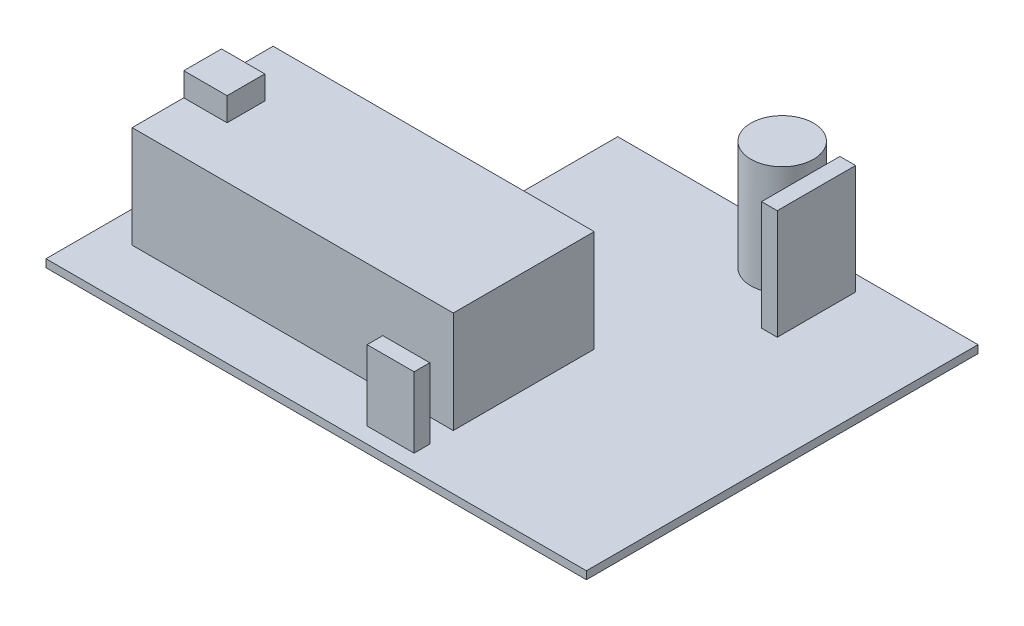
ISO-10303-21;
HEADER;
FILE_DESCRIPTION(('STEP AP214'),'2;1');
FILE_NAME('part.step','',(''),(''),'','','');
FILE_SCHEMA(('AUTOMOTIVE_DESIGN { 1 0 10303 214 1 1 1 1 }'));
ENDSEC;
DATA;
#1=APPLICATION_CONTEXT('core data for automotive mechanical design processes');
#2=APPLICATION_PROTOCOL_DEFINITION('international standard','automotive_design',2000,#1);
#3=PRODUCT_CONTEXT('',#1,'mechanical');
#4=PRODUCT('Part','Part','',(#3));
#5=PRODUCT_RELATED_PRODUCT_CATEGORY('part','',(#4));
#6=PRODUCT_DEFINITION_FORMATION('','',#4);
#7=PRODUCT_DEFINITION_CONTEXT('part definition',#1,'design');
#8=PRODUCT_DEFINITION('design','',#6,#7);
#9=PRODUCT_DEFINITION_SHAPE('','',#8);
#10=(LENGTH_UNIT() NAMED_UNIT(*) SI_UNIT(.MILLI.,.METRE.));
#11=(NAMED_UNIT(*) PLANE_ANGLE_UNIT() SI_UNIT($,.RADIAN.));
#12=(NAMED_UNIT(*) SI_UNIT($,.STERADIAN.) SOLID_ANGLE_UNIT());
#13=UNCERTAINTY_MEASURE_WITH_UNIT(LENGTH_MEASURE(1.E-05),#10,'distance_accuracy_value','');
#14=(GEOMETRIC_REPRESENTATION_CONTEXT(3) GLOBAL_UNCERTAINTY_ASSIGNED_CONTEXT((#13)) GLOBAL_UNIT_ASSIGNED_CONTEXT((#10,
#11,#12)) REPRESENTATION_CONTEXT('',''));
#15=CARTESIAN_POINT('',(0.,0.,0.));
#16=DIRECTION('',(0.,0.,1.));
#17=DIRECTION('',(1.,0.,0.));
#18=AXIS2_PLACEMENT_3D('',#15,#16,#17);
#19=CARTESIAN_POINT('',(0.,1.,0.));
#20=DIRECTION('',(0.,1.,0.));
#21=DIRECTION('',(0.,0.,1.));
#22=AXIS2_PLACEMENT_3D('',#19,#20,#21);
#23=PLANE('',#22);
#24=DIRECTION('',(1.,0.,0.));
#25=VECTOR('',#24,1.);
#26=CARTESIAN_POINT('',(0.,1.,-50.));
#27=LINE('',#26,#25);
#28=CARTESIAN_POINT('',(48.,1.,-50.));
#29=VERTEX_POINT('',#28);
#30=CARTESIAN_POINT('',(69.,1.,-50.));
#31=VERTEX_POINT('',#30);
#32=EDGE_CURVE('E312',#29,#31,#27,.T.);
#33=ORIENTED_EDGE('',*,*,#32,.F.);
#34=CARTESIAN_POINT('',(48.,1.,-46.));
#35=DIRECTION('',(0.,1.,0.));
#36=DIRECTION('',(0.,0.,1.));
#37=AXIS2_PLACEMENT_3D('',#34,#35,#36);
#38=CIRCLE('',#37,4.00000000000001);
#39=EDGE_CURVE('E57',#29,#29,#38,.T.);
#40=ORIENTED_EDGE('',*,*,#39,.F.);
#41=CARTESIAN_POINT('',(23.,1.,-50.));
#42=VERTEX_POINT('',#41);
#43=EDGE_CURVE('E308',#42,#29,#27,.T.);
#44=ORIENTED_EDGE('',*,*,#43,.F.);
#45=DIRECTION('',(0.,0.,1.));
#46=VECTOR('',#45,1.);
#47=CARTESIAN_POINT('',(23.,1.,0.));
#48=LINE('',#47,#46);
#49=CARTESIAN_POINT('',(23.,1.,-32.));
#50=VERTEX_POINT('',#49);
#51=EDGE_CURVE('E311',#42,#50,#48,.T.);
#52=ORIENTED_EDGE('',*,*,#51,.T.);
#53=DIRECTION('',(1.,0.,0.));
#54=VECTOR('',#53,1.);
#55=CARTESIAN_POINT('',(0.,1.,-32.));
#56=LINE('',#55,#54);
#57=CARTESIAN_POINT('',(0.,1.,-32.));
#58=VERTEX_POINT('',#57);
#59=EDGE_CURVE('E314',#58,#50,#56,.T.);
#60=ORIENTED_EDGE('',*,*,#59,.F.);
#61=DIRECTION('',(0.,0.,-1.));
#62=VECTOR('',#61,1.);
#63=CARTESIAN_POINT('',(0.,1.,0.));
#64=LINE('',#63,#62);
#65=CARTESIAN_POINT('',(0.,1.,0.));
#66=VERTEX_POINT('',#65);
#67=EDGE_CURVE('E317',#66,#58,#64,.T.);
#68=ORIENTED_EDGE('',*,*,#67,.F.);
#69=DIRECTION('',(1.,0.,0.));
#70=VECTOR('',#69,1.);
#71=CARTESIAN_POINT('',(0.,1.,0.));
#72=LINE('',#71,#70);
#73=CARTESIAN_POINT('',(69.,1.,0.));
#74=VERTEX_POINT('',#73);
#75=EDGE_CURVE('E320',#66,#74,#72,.T.);
#76=ORIENTED_EDGE('',*,*,#75,.T.);
#77=DIRECTION('',(0.,0.,-1.));
#78=VECTOR('',#77,1.);
#79=CARTESIAN_POINT('',(69.,1.,0.));
#80=LINE('',#79,#78);
#81=EDGE_CURVE('E322',#74,#31,#80,.T.);
#82=ORIENTED_EDGE('',*,*,#81,.T.);
#83=EDGE_LOOP('',(#33,#40,#44,#52,#60,#68,#76,#82));
#84=FACE_BOUND('',#83,.T.);
#85=DIRECTION('',(1.,0.,0.));
#86=VECTOR('',#85,1.);
#87=CARTESIAN_POINT('',(4.,1.,-7.));
#88=LINE('',#87,#86);
#89=CARTESIAN_POINT('',(4.,1.,-7.));
#90=VERTEX_POINT('',#89);
#91=CARTESIAN_POINT('',(45.,1.,-7.));
#92=VERTEX_POINT('',#91);
#93=EDGE_CURVE('E291',#90,#92,#88,.T.);
#94=ORIENTED_EDGE('',*,*,#93,.F.);
#95=DIRECTION('',(0.,0.,1.));
#96=VECTOR('',#95,1.);
#97=CARTESIAN_POINT('',(4.,1.,-25.));
#98=LINE('',#97,#96);
#99=CARTESIAN_POINT('',(4.,1.,-25.));
#100=VERTEX_POINT('',#99);
#101=EDGE_CURVE('E278',#100,#90,#98,.T.);
#102=ORIENTED_EDGE('',*,*,#101,.F.);
#103=DIRECTION('',(-1.,0.,0.));
#104=VECTOR('',#103,1.);
#105=CARTESIAN_POINT('',(4.,1.,-25.));
#106=LINE('',#105,#104);
#107=CARTESIAN_POINT('',(45.,1.,-25.));
#108=VERTEX_POINT('',#107);
#109=EDGE_CURVE('E296',#108,#100,#106,.T.);
#110=ORIENTED_EDGE('',*,*,#109,.F.);
#111=DIRECTION('',(0.,0.,-1.));
#112=VECTOR('',#111,1.);
#113=CARTESIAN_POINT('',(45.,1.,-25.));
#114=LINE('',#113,#112);
#115=EDGE_CURVE('E293',#92,#108,#114,.T.);
#116=ORIENTED_EDGE('',*,*,#115,.F.);
#117=EDGE_LOOP('',(#94,#102,#110,#116));
#118=FACE_BOUND('',#117,.T.);
#119=DIRECTION('',(-1.,0.,0.));
#120=VECTOR('',#119,1.);
#121=CARTESIAN_POINT('',(45.,1.,-4.));
#122=LINE('',#121,#120);
#123=CARTESIAN_POINT('',(45.,1.,-4.));
#124=VERTEX_POINT('',#123);
#125=CARTESIAN_POINT('',(39.,1.,-4.));
#126=VERTEX_POINT('',#125);
#127=EDGE_CURVE('E233',#124,#126,#122,.T.);
#128=ORIENTED_EDGE('',*,*,#127,.F.);
#129=DIRECTION('',(0.,0.,-1.));
#130=VECTOR('',#129,1.);
#131=CARTESIAN_POINT('',(45.,1.,-4.));
#132=LINE('',#131,#130);
#133=CARTESIAN_POINT('',(45.,1.,-2.));
#134=VERTEX_POINT('',#133);
#135=EDGE_CURVE('E218',#134,#124,#132,.T.);
#136=ORIENTED_EDGE('',*,*,#135,.F.);
#137=DIRECTION('',(1.,0.,0.));
#138=VECTOR('',#137,1.);
#139=CARTESIAN_POINT('',(45.,1.,-2.));
#140=LINE('',#139,#138);
#141=CARTESIAN_POINT('',(39.,1.,-2.));
#142=VERTEX_POINT('',#141);
#143=EDGE_CURVE('E224',#142,#134,#140,.T.);
#144=ORIENTED_EDGE('',*,*,#143,.F.);
#145=DIRECTION('',(0.,0.,1.));
#146=VECTOR('',#145,1.);
#147=CARTESIAN_POINT('',(39.,1.,-4.));
#148=LINE('',#147,#146);
#149=EDGE_CURVE('E235',#126,#142,#148,.T.);
#150=ORIENTED_EDGE('',*,*,#149,.F.);
#151=EDGE_LOOP('',(#128,#136,#144,#150));
#152=FACE_BOUND('',#151,.T.);
#153=DIRECTION('',(1.,0.,0.));
#154=VECTOR('',#153,1.);
#155=CARTESIAN_POINT('',(53.3685470889416,1.,-38.));
#156=LINE('',#155,#154);
#157=CARTESIAN_POINT('',(53.3685470889416,1.,-38.));
#158=VERTEX_POINT('',#157);
#159=CARTESIAN_POINT('',(55.3685470889416,1.,-38.));
#160=VERTEX_POINT('',#159);
#161=EDGE_CURVE('E649',#158,#160,#156,.T.);
#162=ORIENTED_EDGE('',*,*,#161,.F.);
#163=DIRECTION('',(0.,0.,1.));
#164=VECTOR('',#163,1.);
#165=CARTESIAN_POINT('',(53.3685470889416,1.,-48.));
#166=LINE('',#165,#164);
#167=CARTESIAN_POINT('',(53.3685470889416,1.,-48.));
#168=VERTEX_POINT('',#167);
#169=EDGE_CURVE('E209',#168,#158,#166,.T.);
#170=ORIENTED_EDGE('',*,*,#169,.F.);
#171=DIRECTION('',(-1.,0.,0.));
#172=VECTOR('',#171,1.);
#173=CARTESIAN_POINT('',(53.3685470889416,1.,-48.));
#174=LINE('',#173,#172);
#175=CARTESIAN_POINT('',(55.3685470889416,1.,-48.));
#176=VERTEX_POINT('',#175);
#177=EDGE_CURVE('E205',#176,#168,#174,.T.);
#178=ORIENTED_EDGE('',*,*,#177,.F.);
#179=DIRECTION('',(0.,0.,-1.));
#180=VECTOR('',#179,1.);
#181=CARTESIAN_POINT('',(55.3685470889416,1.,-48.));
#182=LINE('',#181,#180);
#183=EDGE_CURVE('E646',#160,#176,#182,.T.);
#184=ORIENTED_EDGE('',*,*,#183,.F.);
#185=EDGE_LOOP('',(#162,#170,#178,#184));
#186=FACE_BOUND('',#185,.T.);
#187=ADVANCED_FACE('F36',(#84,#118,#152,#186),#23,.T.);
#188=CARTESIAN_POINT('',(0.,1.,-50.));
#189=DIRECTION('',(0.,0.,-1.));
#190=DIRECTION('',(-1.,0.,0.));
#191=AXIS2_PLACEMENT_3D('',#188,#189,#190);
#192=PLANE('',#191);
#193=DIRECTION('',(1.,0.,0.));
#194=VECTOR('',#193,1.);
#195=CARTESIAN_POINT('',(0.,0.,-50.));
#196=LINE('',#195,#194);
#197=CARTESIAN_POINT('',(23.,0.,-50.));
#198=VERTEX_POINT('',#197);
#199=CARTESIAN_POINT('',(69.,0.,-50.));
#200=VERTEX_POINT('',#199);
#201=EDGE_CURVE('E307',#198,#200,#196,.T.);
#202=ORIENTED_EDGE('',*,*,#201,.F.);
#203=DIRECTION('',(0.,-1.,0.));
#204=VECTOR('',#203,1.);
#205=CARTESIAN_POINT('',(23.,1.,-50.));
#206=LINE('',#205,#204);
#207=EDGE_CURVE('E11',#42,#198,#206,.T.);
#208=ORIENTED_EDGE('',*,*,#207,.F.);
#209=ORIENTED_EDGE('',*,*,#43,.T.);
#210=ORIENTED_EDGE('',*,*,#32,.T.);
#211=DIRECTION('',(0.,-1.,0.));
#212=VECTOR('',#211,1.);
#213=CARTESIAN_POINT('',(69.,1.,-50.));
#214=LINE('',#213,#212);
#215=EDGE_CURVE('E325',#31,#200,#214,.T.);
#216=ORIENTED_EDGE('',*,*,#215,.T.);
#217=EDGE_LOOP('',(#202,#208,#209,#210,#216));
#218=FACE_BOUND('',#217,.T.);
#219=ADVANCED_FACE('F38',(#218),#192,.T.);
#220=CARTESIAN_POINT('',(23.,1.,0.));
#221=DIRECTION('',(1.,0.,0.));
#222=DIRECTION('',(0.,0.,-1.));
#223=AXIS2_PLACEMENT_3D('',#220,#221,#222);
#224=PLANE('',#223);
#225=DIRECTION('',(0.,0.,1.));
#226=VECTOR('',#225,1.);
#227=CARTESIAN_POINT('',(23.,0.,0.));
#228=LINE('',#227,#226);
#229=CARTESIAN_POINT('',(23.,0.,-32.));
#230=VERTEX_POINT('',#229);
#231=EDGE_CURVE('E328',#198,#230,#228,.T.);
#232=ORIENTED_EDGE('',*,*,#231,.T.);
#233=DIRECTION('',(0.,-1.,0.));
#234=VECTOR('',#233,1.);
#235=CARTESIAN_POINT('',(23.,1.,-32.));
#236=LINE('',#235,#234);
#237=EDGE_CURVE('E44',#50,#230,#236,.T.);
#238=ORIENTED_EDGE('',*,*,#237,.F.);
#239=ORIENTED_EDGE('',*,*,#51,.F.);
#240=ORIENTED_EDGE('',*,*,#207,.T.);
#241=EDGE_LOOP('',(#232,#238,#239,#240));
#242=FACE_BOUND('',#241,.T.);
#243=ADVANCED_FACE('F357',(#242),#224,.F.);
#244=CARTESIAN_POINT('',(0.,1.,-32.));
#245=DIRECTION('',(0.,0.,-1.));
#246=DIRECTION('',(-1.,0.,0.));
#247=AXIS2_PLACEMENT_3D('',#244,#245,#246);
#248=PLANE('',#247);
#249=DIRECTION('',(1.,0.,0.));
#250=VECTOR('',#249,1.);
#251=CARTESIAN_POINT('',(0.,0.,-32.));
#252=LINE('',#251,#250);
#253=CARTESIAN_POINT('',(0.,0.,-32.));
#254=VERTEX_POINT('',#253);
#255=EDGE_CURVE('E331',#254,#230,#252,.T.);
#256=ORIENTED_EDGE('',*,*,#255,.F.);
#257=DIRECTION('',(0.,-1.,0.));
#258=VECTOR('',#257,1.);
#259=CARTESIAN_POINT('',(0.,1.,-32.));
#260=LINE('',#259,#258);
#261=EDGE_CURVE('E348',#58,#254,#260,.T.);
#262=ORIENTED_EDGE('',*,*,#261,.F.);
#263=ORIENTED_EDGE('',*,*,#59,.T.);
#264=ORIENTED_EDGE('',*,*,#237,.T.);
#265=EDGE_LOOP('',(#256,#262,#263,#264));
#266=FACE_BOUND('',#265,.T.);
#267=ADVANCED_FACE('F352',(#266),#248,.T.);
#268=CARTESIAN_POINT('',(0.,1.,0.));
#269=DIRECTION('',(-1.,0.,0.));
#270=DIRECTION('',(0.,0.,1.));
#271=AXIS2_PLACEMENT_3D('',#268,#269,#270);
#272=PLANE('',#271);
#273=DIRECTION('',(0.,0.,-1.));
#274=VECTOR('',#273,1.);
#275=CARTESIAN_POINT('',(0.,0.,0.));
#276=LINE('',#275,#274);
#277=CARTESIAN_POINT('',(0.,0.,0.));
#278=VERTEX_POINT('',#277);
#279=EDGE_CURVE('E334',#278,#254,#276,.T.);
#280=ORIENTED_EDGE('',*,*,#279,.F.);
#281=DIRECTION('',(0.,-1.,0.));
#282=VECTOR('',#281,1.);
#283=CARTESIAN_POINT('',(0.,1.,0.));
#284=LINE('',#283,#282);
#285=EDGE_CURVE('E346',#66,#278,#284,.T.);
#286=ORIENTED_EDGE('',*,*,#285,.F.);
#287=ORIENTED_EDGE('',*,*,#67,.T.);
#288=ORIENTED_EDGE('',*,*,#261,.T.);
#289=EDGE_LOOP('',(#280,#286,#287,#288));
#290=FACE_BOUND('',#289,.T.);
#291=ADVANCED_FACE('F365',(#290),#272,.T.);
#292=CARTESIAN_POINT('',(0.,1.,0.));
#293=DIRECTION('',(0.,0.,-1.));
#294=DIRECTION('',(-1.,0.,0.));
#295=AXIS2_PLACEMENT_3D('',#292,#293,#294);
#296=PLANE('',#295);
#297=DIRECTION('',(1.,0.,0.));
#298=VECTOR('',#297,1.);
#299=CARTESIAN_POINT('',(0.,0.,0.));
#300=LINE('',#299,#298);
#301=CARTESIAN_POINT('',(69.,0.,0.));
#302=VERTEX_POINT('',#301);
#303=EDGE_CURVE('E337',#278,#302,#300,.T.);
#304=ORIENTED_EDGE('',*,*,#303,.T.);
#305=DIRECTION('',(0.,-1.,0.));
#306=VECTOR('',#305,1.);
#307=CARTESIAN_POINT('',(69.,1.,0.));
#308=LINE('',#307,#306);
#309=EDGE_CURVE('E343',#74,#302,#308,.T.);
#310=ORIENTED_EDGE('',*,*,#309,.F.);
#311=ORIENTED_EDGE('',*,*,#75,.F.);
#312=ORIENTED_EDGE('',*,*,#285,.T.);
#313=EDGE_LOOP('',(#304,#310,#311,#312));
#314=FACE_BOUND('',#313,.T.);
#315=ADVANCED_FACE('F379',(#314),#296,.F.);
#316=CARTESIAN_POINT('',(69.,1.,0.));
#317=DIRECTION('',(-1.,0.,0.));
#318=DIRECTION('',(0.,0.,1.));
#319=AXIS2_PLACEMENT_3D('',#316,#317,#318);
#320=PLANE('',#319);
#321=DIRECTION('',(0.,0.,-1.));
#322=VECTOR('',#321,1.);
#323=CARTESIAN_POINT('',(69.,0.,0.));
#324=LINE('',#323,#322);
#325=EDGE_CURVE('E339',#302,#200,#324,.T.);
#326=ORIENTED_EDGE('',*,*,#325,.T.);
#327=ORIENTED_EDGE('',*,*,#215,.F.);
#328=ORIENTED_EDGE('',*,*,#81,.F.);
#329=ORIENTED_EDGE('',*,*,#309,.T.);
#330=EDGE_LOOP('',(#326,#327,#328,#329));
#331=FACE_BOUND('',#330,.T.);
#332=ADVANCED_FACE('F375',(#331),#320,.F.);
#333=CARTESIAN_POINT('',(0.,0.,0.));
#334=DIRECTION('',(0.,1.,0.));
#335=DIRECTION('',(0.,0.,1.));
#336=AXIS2_PLACEMENT_3D('',#333,#334,#335);
#337=PLANE('',#336);
#338=ORIENTED_EDGE('',*,*,#201,.T.);
#339=ORIENTED_EDGE('',*,*,#325,.F.);
#340=ORIENTED_EDGE('',*,*,#303,.F.);
#341=ORIENTED_EDGE('',*,*,#279,.T.);
#342=ORIENTED_EDGE('',*,*,#255,.T.);
#343=ORIENTED_EDGE('',*,*,#231,.F.);
#344=EDGE_LOOP('',(#338,#339,#340,#341,#342,#343));
#345=FACE_BOUND('',#344,.T.);
#346=ADVANCED_FACE('F360',(#345),#337,.F.);
#347=CARTESIAN_POINT('',(4.,14.,-25.));
#348=DIRECTION('',(1.,0.,0.));
#349=DIRECTION('',(0.,0.,-1.));
#350=AXIS2_PLACEMENT_3D('',#347,#348,#349);
#351=PLANE('',#350);
#352=ORIENTED_EDGE('',*,*,#101,.T.);
#353=DIRECTION('',(0.,-1.,0.));
#354=VECTOR('',#353,1.);
#355=CARTESIAN_POINT('',(4.,14.,-7.));
#356=LINE('',#355,#354);
#357=CARTESIAN_POINT('',(4.,14.,-7.));
#358=VERTEX_POINT('',#357);
#359=EDGE_CURVE('E305',#358,#90,#356,.T.);
#360=ORIENTED_EDGE('',*,*,#359,.F.);
#361=DIRECTION('',(0.,0.,1.));
#362=VECTOR('',#361,1.);
#363=CARTESIAN_POINT('',(4.,14.,-25.));
#364=LINE('',#363,#362);
#365=CARTESIAN_POINT('',(4.,14.,-13.5914102064778));
#366=VERTEX_POINT('',#365);
#367=EDGE_CURVE('E282',#366,#358,#364,.T.);
#368=ORIENTED_EDGE('',*,*,#367,.F.);
#369=DIRECTION('',(0.,-1.,0.));
#370=VECTOR('',#369,1.);
#371=CARTESIAN_POINT('',(4.,17.,-13.5914102064778));
#372=LINE('',#371,#370);
#373=CARTESIAN_POINT('',(4.,17.,-13.5914102064778));
#374=VERTEX_POINT('',#373);
#375=EDGE_CURVE('E275',#374,#366,#372,.T.);
#376=ORIENTED_EDGE('',*,*,#375,.F.);
#377=DIRECTION('',(0.,0.,1.));
#378=VECTOR('',#377,1.);
#379=CARTESIAN_POINT('',(4.,17.,-18.4085897935222));
#380=LINE('',#379,#378);
#381=CARTESIAN_POINT('',(4.,17.,-18.4085897935222));
#382=VERTEX_POINT('',#381);
#383=EDGE_CURVE('E249',#382,#374,#380,.T.);
#384=ORIENTED_EDGE('',*,*,#383,.F.);
#385=DIRECTION('',(0.,-1.,0.));
#386=VECTOR('',#385,1.);
#387=CARTESIAN_POINT('',(4.,17.,-18.4085897935222));
#388=LINE('',#387,#386);
#389=CARTESIAN_POINT('',(4.,14.,-18.4085897935222));
#390=VERTEX_POINT('',#389);
#391=EDGE_CURVE('E259',#382,#390,#388,.T.);
#392=ORIENTED_EDGE('',*,*,#391,.T.);
#393=CARTESIAN_POINT('',(4.,14.,-25.));
#394=VERTEX_POINT('',#393);
#395=EDGE_CURVE('E279',#394,#390,#364,.T.);
#396=ORIENTED_EDGE('',*,*,#395,.F.);
#397=DIRECTION('',(0.,-1.,0.));
#398=VECTOR('',#397,1.);
#399=CARTESIAN_POINT('',(4.,14.,-25.));
#400=LINE('',#399,#398);
#401=EDGE_CURVE('E288',#394,#100,#400,.T.);
#402=ORIENTED_EDGE('',*,*,#401,.T.);
#403=EDGE_LOOP('',(#352,#360,#368,#376,#384,#392,#396,#402));
#404=FACE_BOUND('',#403,.T.);
#405=ADVANCED_FACE('F395',(#404),#351,.F.);
#406=CARTESIAN_POINT('',(4.,14.,-7.));
#407=DIRECTION('',(0.,0.,-1.));
#408=DIRECTION('',(-1.,0.,0.));
#409=AXIS2_PLACEMENT_3D('',#406,#407,#408);
#410=PLANE('',#409);
#411=ORIENTED_EDGE('',*,*,#93,.T.);
#412=DIRECTION('',(0.,-1.,0.));
#413=VECTOR('',#412,1.);
#414=CARTESIAN_POINT('',(45.,14.,-7.));
#415=LINE('',#414,#413);
#416=CARTESIAN_POINT('',(45.,14.,-7.));
#417=VERTEX_POINT('',#416);
#418=EDGE_CURVE('E302',#417,#92,#415,.T.);
#419=ORIENTED_EDGE('',*,*,#418,.F.);
#420=DIRECTION('',(1.,0.,0.));
#421=VECTOR('',#420,1.);
#422=CARTESIAN_POINT('',(4.,14.,-7.));
#423=LINE('',#422,#421);
#424=EDGE_CURVE('E281',#358,#417,#423,.T.);
#425=ORIENTED_EDGE('',*,*,#424,.F.);
#426=ORIENTED_EDGE('',*,*,#359,.T.);
#427=EDGE_LOOP('',(#411,#419,#425,#426));
#428=FACE_BOUND('',#427,.T.);
#429=ADVANCED_FACE('F401',(#428),#410,.F.);
#430=CARTESIAN_POINT('',(45.,14.,-25.));
#431=DIRECTION('',(-1.,0.,0.));
#432=DIRECTION('',(0.,0.,1.));
#433=AXIS2_PLACEMENT_3D('',#430,#431,#432);
#434=PLANE('',#433);
#435=ORIENTED_EDGE('',*,*,#115,.T.);
#436=DIRECTION('',(0.,-1.,0.));
#437=VECTOR('',#436,1.);
#438=CARTESIAN_POINT('',(45.,14.,-25.));
#439=LINE('',#438,#437);
#440=CARTESIAN_POINT('',(45.,14.,-25.));
#441=VERTEX_POINT('',#440);
#442=EDGE_CURVE('E300',#441,#108,#439,.T.);
#443=ORIENTED_EDGE('',*,*,#442,.F.);
#444=DIRECTION('',(0.,0.,-1.));
#445=VECTOR('',#444,1.);
#446=CARTESIAN_POINT('',(45.,14.,-25.));
#447=LINE('',#446,#445);
#448=EDGE_CURVE('E284',#417,#441,#447,.T.);
#449=ORIENTED_EDGE('',*,*,#448,.F.);
#450=ORIENTED_EDGE('',*,*,#418,.T.);
#451=EDGE_LOOP('',(#435,#443,#449,#450));
#452=FACE_BOUND('',#451,.T.);
#453=ADVANCED_FACE('F406',(#452),#434,.F.);
#454=CARTESIAN_POINT('',(4.,14.,-25.));
#455=DIRECTION('',(0.,0.,1.));
#456=DIRECTION('',(1.,0.,0.));
#457=AXIS2_PLACEMENT_3D('',#454,#455,#456);
#458=PLANE('',#457);
#459=ORIENTED_EDGE('',*,*,#109,.T.);
#460=ORIENTED_EDGE('',*,*,#401,.F.);
#461=DIRECTION('',(-1.,0.,0.));
#462=VECTOR('',#461,1.);
#463=CARTESIAN_POINT('',(4.,14.,-25.));
#464=LINE('',#463,#462);
#465=EDGE_CURVE('E286',#441,#394,#464,.T.);
#466=ORIENTED_EDGE('',*,*,#465,.F.);
#467=ORIENTED_EDGE('',*,*,#442,.T.);
#468=EDGE_LOOP('',(#459,#460,#466,#467));
#469=FACE_BOUND('',#468,.T.);
#470=ADVANCED_FACE('F452',(#469),#458,.F.);
#471=CARTESIAN_POINT('',(0.,14.,0.));
#472=DIRECTION('',(0.,1.,0.));
#473=DIRECTION('',(0.,0.,1.));
#474=AXIS2_PLACEMENT_3D('',#471,#472,#473);
#475=PLANE('',#474);
#476=DIRECTION('',(-1.,0.,0.));
#477=VECTOR('',#476,1.);
#478=CARTESIAN_POINT('',(4.,14.,-18.4085897935222));
#479=LINE('',#478,#477);
#480=CARTESIAN_POINT('',(9.52799134150682,14.,-18.4085897935222));
#481=VERTEX_POINT('',#480);
#482=EDGE_CURVE('E253',#481,#390,#479,.T.);
#483=ORIENTED_EDGE('',*,*,#482,.F.);
#484=DIRECTION('',(0.,0.,-1.));
#485=VECTOR('',#484,1.);
#486=CARTESIAN_POINT('',(9.52799134150682,14.,-18.4085897935222));
#487=LINE('',#486,#485);
#488=CARTESIAN_POINT('',(9.52799134150682,14.,-13.5914102064778));
#489=VERTEX_POINT('',#488);
#490=EDGE_CURVE('E262',#489,#481,#487,.T.);
#491=ORIENTED_EDGE('',*,*,#490,.F.);
#492=DIRECTION('',(1.,0.,0.));
#493=VECTOR('',#492,1.);
#494=CARTESIAN_POINT('',(4.,14.,-13.5914102064778));
#495=LINE('',#494,#493);
#496=EDGE_CURVE('E248',#366,#489,#495,.T.);
#497=ORIENTED_EDGE('',*,*,#496,.F.);
#498=ORIENTED_EDGE('',*,*,#367,.T.);
#499=ORIENTED_EDGE('',*,*,#424,.T.);
#500=ORIENTED_EDGE('',*,*,#448,.T.);
#501=ORIENTED_EDGE('',*,*,#465,.T.);
#502=ORIENTED_EDGE('',*,*,#395,.T.);
#503=EDGE_LOOP('',(#483,#491,#497,#498,#499,#500,#501,#502));
#504=FACE_BOUND('',#503,.T.);
#505=ADVANCED_FACE('F424',(#504),#475,.T.);
#506=CARTESIAN_POINT('',(4.,17.,-13.5914102064778));
#507=DIRECTION('',(0.,0.,-1.));
#508=DIRECTION('',(-1.,0.,0.));
#509=AXIS2_PLACEMENT_3D('',#506,#507,#508);
#510=PLANE('',#509);
#511=ORIENTED_EDGE('',*,*,#496,.T.);
#512=DIRECTION('',(0.,-1.,0.));
#513=VECTOR('',#512,1.);
#514=CARTESIAN_POINT('',(9.52799134150682,17.,-13.5914102064778));
#515=LINE('',#514,#513);
#516=CARTESIAN_POINT('',(9.52799134150682,17.,-13.5914102064778));
#517=VERTEX_POINT('',#516);
#518=EDGE_CURVE('E272',#517,#489,#515,.T.);
#519=ORIENTED_EDGE('',*,*,#518,.F.);
#520=DIRECTION('',(1.,0.,0.));
#521=VECTOR('',#520,1.);
#522=CARTESIAN_POINT('',(4.,17.,-13.5914102064778));
#523=LINE('',#522,#521);
#524=EDGE_CURVE('E252',#374,#517,#523,.T.);
#525=ORIENTED_EDGE('',*,*,#524,.F.);
#526=ORIENTED_EDGE('',*,*,#375,.T.);
#527=EDGE_LOOP('',(#511,#519,#525,#526));
#528=FACE_BOUND('',#527,.T.);
#529=ADVANCED_FACE('F428',(#528),#510,.F.);
#530=CARTESIAN_POINT('',(9.52799134150682,17.,-18.4085897935222));
#531=DIRECTION('',(-1.,0.,0.));
#532=DIRECTION('',(0.,0.,1.));
#533=AXIS2_PLACEMENT_3D('',#530,#531,#532);
#534=PLANE('',#533);
#535=ORIENTED_EDGE('',*,*,#490,.T.);
#536=DIRECTION('',(0.,-1.,0.));
#537=VECTOR('',#536,1.);
#538=CARTESIAN_POINT('',(9.52799134150682,17.,-18.4085897935222));
#539=LINE('',#538,#537);
#540=CARTESIAN_POINT('',(9.52799134150682,17.,-18.4085897935222));
#541=VERTEX_POINT('',#540);
#542=EDGE_CURVE('E269',#541,#481,#539,.T.);
#543=ORIENTED_EDGE('',*,*,#542,.F.);
#544=DIRECTION('',(0.,0.,-1.));
#545=VECTOR('',#544,1.);
#546=CARTESIAN_POINT('',(9.52799134150682,17.,-18.4085897935222));
#547=LINE('',#546,#545);
#548=EDGE_CURVE('E255',#517,#541,#547,.T.);
#549=ORIENTED_EDGE('',*,*,#548,.F.);
#550=ORIENTED_EDGE('',*,*,#518,.T.);
#551=EDGE_LOOP('',(#535,#543,#549,#550));
#552=FACE_BOUND('',#551,.T.);
#553=ADVANCED_FACE('F439',(#552),#534,.F.);
#554=CARTESIAN_POINT('',(4.,17.,-18.4085897935222));
#555=DIRECTION('',(0.,0.,1.));
#556=DIRECTION('',(1.,0.,0.));
#557=AXIS2_PLACEMENT_3D('',#554,#555,#556);
#558=PLANE('',#557);
#559=ORIENTED_EDGE('',*,*,#482,.T.);
#560=ORIENTED_EDGE('',*,*,#391,.F.);
#561=DIRECTION('',(-1.,0.,0.));
#562=VECTOR('',#561,1.);
#563=CARTESIAN_POINT('',(4.,17.,-18.4085897935222));
#564=LINE('',#563,#562);
#565=EDGE_CURVE('E257',#541,#382,#564,.T.);
#566=ORIENTED_EDGE('',*,*,#565,.F.);
#567=ORIENTED_EDGE('',*,*,#542,.T.);
#568=EDGE_LOOP('',(#559,#560,#566,#567));
#569=FACE_BOUND('',#568,.T.);
#570=ADVANCED_FACE('F436',(#569),#558,.F.);
#571=CARTESIAN_POINT('',(0.,17.,0.));
#572=DIRECTION('',(0.,1.,0.));
#573=DIRECTION('',(0.,0.,1.));
#574=AXIS2_PLACEMENT_3D('',#571,#572,#573);
#575=PLANE('',#574);
#576=ORIENTED_EDGE('',*,*,#383,.T.);
#577=ORIENTED_EDGE('',*,*,#524,.T.);
#578=ORIENTED_EDGE('',*,*,#548,.T.);
#579=ORIENTED_EDGE('',*,*,#565,.T.);
#580=EDGE_LOOP('',(#576,#577,#578,#579));
#581=FACE_BOUND('',#580,.T.);
#582=ADVANCED_FACE('F432',(#581),#575,.T.);
#583=CARTESIAN_POINT('',(45.,10.,-4.));
#584=DIRECTION('',(-1.,0.,0.));
#585=DIRECTION('',(0.,0.,1.));
#586=AXIS2_PLACEMENT_3D('',#583,#584,#585);
#587=PLANE('',#586);
#588=ORIENTED_EDGE('',*,*,#135,.T.);
#589=DIRECTION('',(0.,-1.,0.));
#590=VECTOR('',#589,1.);
#591=CARTESIAN_POINT('',(45.,10.,-4.));
#592=LINE('',#591,#590);
#593=CARTESIAN_POINT('',(45.,10.,-4.));
#594=VERTEX_POINT('',#593);
#595=EDGE_CURVE('E246',#594,#124,#592,.T.);
#596=ORIENTED_EDGE('',*,*,#595,.F.);
#597=DIRECTION('',(0.,0.,-1.));
#598=VECTOR('',#597,1.);
#599=CARTESIAN_POINT('',(45.,10.,-4.));
#600=LINE('',#599,#598);
#601=CARTESIAN_POINT('',(45.,10.,-2.));
#602=VERTEX_POINT('',#601);
#603=EDGE_CURVE('E220',#602,#594,#600,.T.);
#604=ORIENTED_EDGE('',*,*,#603,.F.);
#605=DIRECTION('',(0.,-1.,0.));
#606=VECTOR('',#605,1.);
#607=CARTESIAN_POINT('',(45.,10.,-2.));
#608=LINE('',#607,#606);
#609=EDGE_CURVE('E230',#602,#134,#608,.T.);
#610=ORIENTED_EDGE('',*,*,#609,.T.);
#611=EDGE_LOOP('',(#588,#596,#604,#610));
#612=FACE_BOUND('',#611,.T.);
#613=ADVANCED_FACE('F497',(#612),#587,.F.);
#614=CARTESIAN_POINT('',(45.,10.,-4.));
#615=DIRECTION('',(0.,0.,1.));
#616=DIRECTION('',(1.,0.,0.));
#617=AXIS2_PLACEMENT_3D('',#614,#615,#616);
#618=PLANE('',#617);
#619=ORIENTED_EDGE('',*,*,#127,.T.);
#620=DIRECTION('',(0.,-1.,0.));
#621=VECTOR('',#620,1.);
#622=CARTESIAN_POINT('',(39.,10.,-4.));
#623=LINE('',#622,#621);
#624=CARTESIAN_POINT('',(39.,10.,-4.));
#625=VERTEX_POINT('',#624);
#626=EDGE_CURVE('E243',#625,#126,#623,.T.);
#627=ORIENTED_EDGE('',*,*,#626,.F.);
#628=DIRECTION('',(-1.,0.,0.));
#629=VECTOR('',#628,1.);
#630=CARTESIAN_POINT('',(45.,10.,-4.));
#631=LINE('',#630,#629);
#632=EDGE_CURVE('E223',#594,#625,#631,.T.);
#633=ORIENTED_EDGE('',*,*,#632,.F.);
#634=ORIENTED_EDGE('',*,*,#595,.T.);
#635=EDGE_LOOP('',(#619,#627,#633,#634));
#636=FACE_BOUND('',#635,.T.);
#637=ADVANCED_FACE('F506',(#636),#618,.F.);
#638=CARTESIAN_POINT('',(39.,10.,-4.));
#639=DIRECTION('',(1.,0.,0.));
#640=DIRECTION('',(0.,0.,-1.));
#641=AXIS2_PLACEMENT_3D('',#638,#639,#640);
#642=PLANE('',#641);
#643=ORIENTED_EDGE('',*,*,#149,.T.);
#644=DIRECTION('',(0.,-1.,0.));
#645=VECTOR('',#644,1.);
#646=CARTESIAN_POINT('',(39.,10.,-2.));
#647=LINE('',#646,#645);
#648=CARTESIAN_POINT('',(39.,10.,-2.));
#649=VERTEX_POINT('',#648);
#650=EDGE_CURVE('E241',#649,#142,#647,.T.);
#651=ORIENTED_EDGE('',*,*,#650,.F.);
#652=DIRECTION('',(0.,0.,1.));
#653=VECTOR('',#652,1.);
#654=CARTESIAN_POINT('',(39.,10.,-4.));
#655=LINE('',#654,#653);
#656=EDGE_CURVE('E226',#625,#649,#655,.T.);
#657=ORIENTED_EDGE('',*,*,#656,.F.);
#658=ORIENTED_EDGE('',*,*,#626,.T.);
#659=EDGE_LOOP('',(#643,#651,#657,#658));
#660=FACE_BOUND('',#659,.T.);
#661=ADVANCED_FACE('F518',(#660),#642,.F.);
#662=CARTESIAN_POINT('',(45.,10.,-2.));
#663=DIRECTION('',(0.,0.,-1.));
#664=DIRECTION('',(-1.,0.,0.));
#665=AXIS2_PLACEMENT_3D('',#662,#663,#664);
#666=PLANE('',#665);
#667=ORIENTED_EDGE('',*,*,#143,.T.);
#668=ORIENTED_EDGE('',*,*,#609,.F.);
#669=DIRECTION('',(1.,0.,0.));
#670=VECTOR('',#669,1.);
#671=CARTESIAN_POINT('',(45.,10.,-2.));
#672=LINE('',#671,#670);
#673=EDGE_CURVE('E228',#649,#602,#672,.T.);
#674=ORIENTED_EDGE('',*,*,#673,.F.);
#675=ORIENTED_EDGE('',*,*,#650,.T.);
#676=EDGE_LOOP('',(#667,#668,#674,#675));
#677=FACE_BOUND('',#676,.T.);
#678=ADVANCED_FACE('F528',(#677),#666,.F.);
#679=CARTESIAN_POINT('',(0.,10.,0.));
#680=DIRECTION('',(0.,-1.,0.));
#681=DIRECTION('',(0.,0.,-1.));
#682=AXIS2_PLACEMENT_3D('',#679,#680,#681);
#683=PLANE('',#682);
#684=ORIENTED_EDGE('',*,*,#603,.T.);
#685=ORIENTED_EDGE('',*,*,#632,.T.);
#686=ORIENTED_EDGE('',*,*,#656,.T.);
#687=ORIENTED_EDGE('',*,*,#673,.T.);
#688=EDGE_LOOP('',(#684,#685,#686,#687));
#689=FACE_BOUND('',#688,.T.);
#690=ADVANCED_FACE('F539',(#689),#683,.F.);
#691=CARTESIAN_POINT('',(48.,15.,-46.));
#692=DIRECTION('',(0.,-1.,0.));
#693=DIRECTION('',(0.,0.,-1.));
#694=AXIS2_PLACEMENT_3D('',#691,#692,#693);
#695=CYLINDRICAL_SURFACE('',#694,4.00000000000001);
#696=CARTESIAN_POINT('',(48.,15.,-46.));
#697=DIRECTION('',(0.,1.,0.));
#698=DIRECTION('',(0.,0.,1.));
#699=AXIS2_PLACEMENT_3D('',#696,#697,#698);
#700=CIRCLE('',#699,4.00000000000001);
#701=CARTESIAN_POINT('',(48.,15.,-42.));
#702=VERTEX_POINT('',#701);
#703=EDGE_CURVE('E212',#702,#702,#700,.T.);
#704=ORIENTED_EDGE('',*,*,#703,.F.);
#705=EDGE_LOOP('',(#704));
#706=FACE_BOUND('',#705,.T.);
#707=ORIENTED_EDGE('',*,*,#39,.T.);
#708=EDGE_LOOP('',(#707));
#709=FACE_BOUND('',#708,.T.);
#710=ADVANCED_FACE('F550',(#706,#709),#695,.T.);
#711=CARTESIAN_POINT('',(48.,15.,-46.));
#712=DIRECTION('',(0.,1.,0.));
#713=DIRECTION('',(0.,0.,1.));
#714=AXIS2_PLACEMENT_3D('',#711,#712,#713);
#715=PLANE('',#714);
#716=ORIENTED_EDGE('',*,*,#703,.T.);
#717=EDGE_LOOP('',(#716));
#718=FACE_BOUND('',#717,.T.);
#719=ADVANCED_FACE('F569',(#718),#715,.T.);
#720=CARTESIAN_POINT('',(53.3685470889416,15.,-48.));
#721=DIRECTION('',(1.,0.,0.));
#722=DIRECTION('',(0.,0.,-1.));
#723=AXIS2_PLACEMENT_3D('',#720,#721,#722);
#724=PLANE('',#723);
#725=ORIENTED_EDGE('',*,*,#169,.T.);
#726=DIRECTION('',(0.,-1.,0.));
#727=VECTOR('',#726,1.);
#728=CARTESIAN_POINT('',(53.3685470889416,15.,-38.));
#729=LINE('',#728,#727);
#730=CARTESIAN_POINT('',(53.3685470889416,15.,-38.));
#731=VERTEX_POINT('',#730);
#732=EDGE_CURVE('E190',#731,#158,#729,.T.);
#733=ORIENTED_EDGE('',*,*,#732,.F.);
#734=DIRECTION('',(0.,0.,1.));
#735=VECTOR('',#734,1.);
#736=CARTESIAN_POINT('',(53.3685470889416,15.,-48.));
#737=LINE('',#736,#735);
#738=CARTESIAN_POINT('',(53.3685470889416,15.,-48.));
#739=VERTEX_POINT('',#738);
#740=EDGE_CURVE('E197',#739,#731,#737,.T.);
#741=ORIENTED_EDGE('',*,*,#740,.F.);
#742=DIRECTION('',(0.,-1.,0.));
#743=VECTOR('',#742,1.);
#744=CARTESIAN_POINT('',(53.3685470889416,15.,-48.));
#745=LINE('',#744,#743);
#746=EDGE_CURVE('E643',#739,#168,#745,.T.);
#747=ORIENTED_EDGE('',*,*,#746,.T.);
#748=EDGE_LOOP('',(#725,#733,#741,#747));
#749=FACE_BOUND('',#748,.T.);
#750=ADVANCED_FACE('F207',(#749),#724,.F.);
#751=CARTESIAN_POINT('',(53.3685470889416,15.,-38.));
#752=DIRECTION('',(0.,0.,-1.));
#753=DIRECTION('',(-1.,0.,0.));
#754=AXIS2_PLACEMENT_3D('',#751,#752,#753);
#755=PLANE('',#754);
#756=ORIENTED_EDGE('',*,*,#161,.T.);
#757=DIRECTION('',(0.,-1.,0.));
#758=VECTOR('',#757,1.);
#759=CARTESIAN_POINT('',(55.3685470889416,15.,-38.));
#760=LINE('',#759,#758);
#761=CARTESIAN_POINT('',(55.3685470889416,15.,-38.));
#762=VERTEX_POINT('',#761);
#763=EDGE_CURVE('E193',#762,#160,#760,.T.);
#764=ORIENTED_EDGE('',*,*,#763,.F.);
#765=DIRECTION('',(1.,0.,0.));
#766=VECTOR('',#765,1.);
#767=CARTESIAN_POINT('',(53.3685470889416,15.,-38.));
#768=LINE('',#767,#766);
#769=EDGE_CURVE('E186',#731,#762,#768,.T.);
#770=ORIENTED_EDGE('',*,*,#769,.F.);
#771=ORIENTED_EDGE('',*,*,#732,.T.);
#772=EDGE_LOOP('',(#756,#764,#770,#771));
#773=FACE_BOUND('',#772,.T.);
#774=ADVANCED_FACE('F188',(#773),#755,.F.);
#775=CARTESIAN_POINT('',(55.3685470889416,15.,-48.));
#776=DIRECTION('',(-1.,0.,0.));
#777=DIRECTION('',(0.,0.,1.));
#778=AXIS2_PLACEMENT_3D('',#775,#776,#777);
#779=PLANE('',#778);
#780=ORIENTED_EDGE('',*,*,#183,.T.);
#781=DIRECTION('',(0.,-1.,0.));
#782=VECTOR('',#781,1.);
#783=CARTESIAN_POINT('',(55.3685470889416,15.,-48.));
#784=LINE('',#783,#782);
#785=CARTESIAN_POINT('',(55.3685470889416,15.,-48.));
#786=VERTEX_POINT('',#785);
#787=EDGE_CURVE('E51',#786,#176,#784,.T.);
#788=ORIENTED_EDGE('',*,*,#787,.F.);
#789=DIRECTION('',(0.,0.,-1.));
#790=VECTOR('',#789,1.);
#791=CARTESIAN_POINT('',(55.3685470889416,15.,-48.));
#792=LINE('',#791,#790);
#793=EDGE_CURVE('E196',#762,#786,#792,.T.);
#794=ORIENTED_EDGE('',*,*,#793,.F.);
#795=ORIENTED_EDGE('',*,*,#763,.T.);
#796=EDGE_LOOP('',(#780,#788,#794,#795));
#797=FACE_BOUND('',#796,.T.);
#798=ADVANCED_FACE('F607',(#797),#779,.F.);
#799=CARTESIAN_POINT('',(53.3685470889416,15.,-48.));
#800=DIRECTION('',(0.,0.,1.));
#801=DIRECTION('',(1.,0.,0.));
#802=AXIS2_PLACEMENT_3D('',#799,#800,#801);
#803=PLANE('',#802);
#804=ORIENTED_EDGE('',*,*,#177,.T.);
#805=ORIENTED_EDGE('',*,*,#746,.F.);
#806=DIRECTION('',(-1.,0.,0.));
#807=VECTOR('',#806,1.);
#808=CARTESIAN_POINT('',(53.3685470889416,15.,-48.));
#809=LINE('',#808,#807);
#810=EDGE_CURVE('E201',#786,#739,#809,.T.);
#811=ORIENTED_EDGE('',*,*,#810,.F.);
#812=ORIENTED_EDGE('',*,*,#787,.T.);
#813=EDGE_LOOP('',(#804,#805,#811,#812));
#814=FACE_BOUND('',#813,.T.);
#815=ADVANCED_FACE('F616',(#814),#803,.F.);
#816=CARTESIAN_POINT('',(0.,15.,0.));
#817=DIRECTION('',(0.,1.,0.));
#818=DIRECTION('',(0.,0.,1.));
#819=AXIS2_PLACEMENT_3D('',#816,#817,#818);
#820=PLANE('',#819);
#821=ORIENTED_EDGE('',*,*,#740,.T.);
#822=ORIENTED_EDGE('',*,*,#769,.T.);
#823=ORIENTED_EDGE('',*,*,#793,.T.);
#824=ORIENTED_EDGE('',*,*,#810,.T.);
#825=EDGE_LOOP('',(#821,#822,#823,#824));
#826=FACE_BOUND('',#825,.T.);
#827=ADVANCED_FACE('F200',(#826),#820,.T.);
#828=CLOSED_SHELL('',(#187,#219,#243,#267,#291,#315,#332,#346,#405,#429,#453,#470,#505,#529,
#553,#570,#582,#613,#637,#661,#678,#690,#710,#719,#750,#774,#798,#815,#827));
#829=MANIFOLD_SOLID_BREP('B2',#828);
#830=ADVANCED_BREP_SHAPE_REPRESENTATION('',(#18,#829),#14);
#831=SHAPE_DEFINITION_REPRESENTATION(#9,#830);
ENDSEC;
END-ISO-10303-21;
